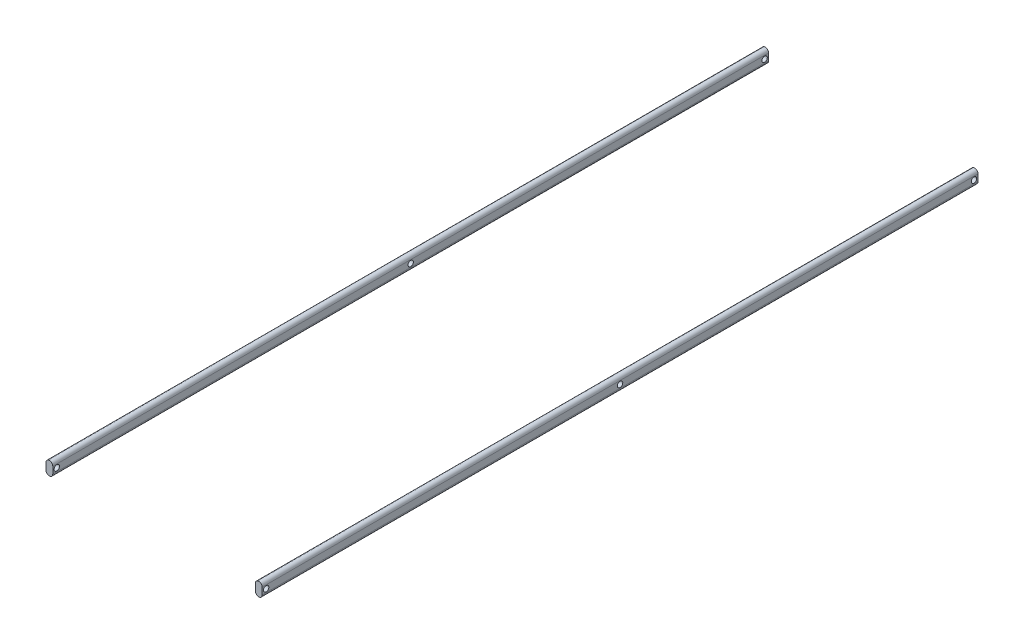
ISO-10303-21;
HEADER;
FILE_DESCRIPTION(('STEP AP214'),'2;1');
FILE_NAME('part.step','',(''),(''),'','','');
FILE_SCHEMA(('AUTOMOTIVE_DESIGN { 1 0 10303 214 1 1 1 1 }'));
ENDSEC;
DATA;
#1=APPLICATION_CONTEXT('core data for automotive mechanical design processes');
#2=APPLICATION_PROTOCOL_DEFINITION('international standard','automotive_design',2000,#1);
#3=PRODUCT_CONTEXT('',#1,'mechanical');
#4=PRODUCT('Part','Part','',(#3));
#5=PRODUCT_RELATED_PRODUCT_CATEGORY('part','',(#4));
#6=PRODUCT_DEFINITION_FORMATION('','',#4);
#7=PRODUCT_DEFINITION_CONTEXT('part definition',#1,'design');
#8=PRODUCT_DEFINITION('design','',#6,#7);
#9=PRODUCT_DEFINITION_SHAPE('','',#8);
#10=(LENGTH_UNIT() NAMED_UNIT(*) SI_UNIT(.MILLI.,.METRE.));
#11=(NAMED_UNIT(*) PLANE_ANGLE_UNIT() SI_UNIT($,.RADIAN.));
#12=(NAMED_UNIT(*) SI_UNIT($,.STERADIAN.) SOLID_ANGLE_UNIT());
#13=UNCERTAINTY_MEASURE_WITH_UNIT(LENGTH_MEASURE(1.E-05),#10,'distance_accuracy_value','');
#14=(GEOMETRIC_REPRESENTATION_CONTEXT(3) GLOBAL_UNCERTAINTY_ASSIGNED_CONTEXT((#13)) GLOBAL_UNIT_ASSIGNED_CONTEXT((#10,
#11,#12)) REPRESENTATION_CONTEXT('',''));
#15=CARTESIAN_POINT('',(0.,0.,0.));
#16=DIRECTION('',(0.,0.,1.));
#17=DIRECTION('',(1.,0.,0.));
#18=AXIS2_PLACEMENT_3D('',#15,#16,#17);
#19=CARTESIAN_POINT('',(26.8333333333334,0.250000000000037,0.));
#20=DIRECTION('',(0.,0.,-1.));
#21=DIRECTION('',(-1.,0.,0.));
#22=AXIS2_PLACEMENT_3D('',#19,#20,#21);
#23=CYLINDRICAL_SURFACE('',#22,2.5);
#24=DIRECTION('',(0.,0.,-1.));
#25=VECTOR('',#24,1.);
#26=CARTESIAN_POINT('',(29.3333333333334,0.250000000000035,530.));
#27=LINE('',#26,#25);
#28=CARTESIAN_POINT('',(29.3333333333334,0.250000000000035,0.));
#29=VERTEX_POINT('',#28);
#30=CARTESIAN_POINT('',(29.3333333333334,0.250000000000035,530.));
#31=VERTEX_POINT('',#30);
#32=EDGE_CURVE('E110',#29,#31,#27,.F.);
#33=ORIENTED_EDGE('',*,*,#32,.F.);
#34=CARTESIAN_POINT('',(26.8333333333334,0.250000000000037,0.));
#35=DIRECTION('',(0.,0.,1.));
#36=DIRECTION('',(1.,0.,0.));
#37=AXIS2_PLACEMENT_3D('',#34,#35,#36);
#38=CIRCLE('',#37,2.5);
#39=CARTESIAN_POINT('',(24.3333333333334,0.250000000000041,0.));
#40=VERTEX_POINT('',#39);
#41=EDGE_CURVE('E68',#40,#29,#38,.F.);
#42=ORIENTED_EDGE('',*,*,#41,.F.);
#43=DIRECTION('',(0.,0.,-1.));
#44=VECTOR('',#43,1.);
#45=CARTESIAN_POINT('',(24.3333333333334,0.250000000000038,530.));
#46=LINE('',#45,#44);
#47=CARTESIAN_POINT('',(24.3333333333334,0.250000000000041,530.));
#48=VERTEX_POINT('',#47);
#49=EDGE_CURVE('E150',#48,#40,#46,.T.);
#50=ORIENTED_EDGE('',*,*,#49,.F.);
#51=CARTESIAN_POINT('',(26.8333333333334,0.250000000000037,530.));
#52=DIRECTION('',(0.,0.,1.));
#53=DIRECTION('',(1.,0.,0.));
#54=AXIS2_PLACEMENT_3D('',#51,#52,#53);
#55=CIRCLE('',#54,2.5);
#56=EDGE_CURVE('E15',#31,#48,#55,.T.);
#57=ORIENTED_EDGE('',*,*,#56,.F.);
#58=EDGE_LOOP('',(#33,#42,#50,#57));
#59=FACE_BOUND('',#58,.T.);
#60=ADVANCED_FACE('F60',(#59),#23,.T.);
#61=CARTESIAN_POINT('',(26.8333333333334,-4.74999999999996,530.));
#62=DIRECTION('',(0.,0.,-1.));
#63=DIRECTION('',(-1.,0.,0.));
#64=AXIS2_PLACEMENT_3D('',#61,#62,#63);
#65=CYLINDRICAL_SURFACE('',#64,2.5);
#66=DIRECTION('',(0.,0.,-1.));
#67=VECTOR('',#66,1.);
#68=CARTESIAN_POINT('',(29.3333333333334,-4.74999999999996,530.));
#69=LINE('',#68,#67);
#70=CARTESIAN_POINT('',(29.3333333333334,-4.74999999999996,530.));
#71=VERTEX_POINT('',#70);
#72=CARTESIAN_POINT('',(29.3333333333334,-4.74999999999996,0.));
#73=VERTEX_POINT('',#72);
#74=EDGE_CURVE('E103',#71,#73,#69,.T.);
#75=ORIENTED_EDGE('',*,*,#74,.F.);
#76=CARTESIAN_POINT('',(26.8333333333334,-4.74999999999996,530.));
#77=DIRECTION('',(0.,0.,1.));
#78=DIRECTION('',(1.,0.,0.));
#79=AXIS2_PLACEMENT_3D('',#76,#77,#78);
#80=CIRCLE('',#79,2.5);
#81=CARTESIAN_POINT('',(24.3333333333334,-4.74999999999996,530.));
#82=VERTEX_POINT('',#81);
#83=EDGE_CURVE('E111',#82,#71,#80,.T.);
#84=ORIENTED_EDGE('',*,*,#83,.F.);
#85=DIRECTION('',(0.,0.,-1.));
#86=VECTOR('',#85,1.);
#87=CARTESIAN_POINT('',(24.3333333333334,-4.74999999999996,530.));
#88=LINE('',#87,#86);
#89=CARTESIAN_POINT('',(24.3333333333334,-4.74999999999996,0.));
#90=VERTEX_POINT('',#89);
#91=EDGE_CURVE('E106',#90,#82,#88,.F.);
#92=ORIENTED_EDGE('',*,*,#91,.F.);
#93=CARTESIAN_POINT('',(26.8333333333334,-4.74999999999996,0.));
#94=DIRECTION('',(0.,0.,1.));
#95=DIRECTION('',(1.,0.,0.));
#96=AXIS2_PLACEMENT_3D('',#93,#94,#95);
#97=CIRCLE('',#96,2.5);
#98=EDGE_CURVE('E99',#73,#90,#97,.F.);
#99=ORIENTED_EDGE('',*,*,#98,.F.);
#100=EDGE_LOOP('',(#75,#84,#92,#99));
#101=FACE_BOUND('',#100,.T.);
#102=ADVANCED_FACE('F101',(#101),#65,.T.);
#103=CARTESIAN_POINT('',(24.3333333333334,2.75000000000004,530.));
#104=DIRECTION('',(1.,0.,0.));
#105=DIRECTION('',(0.,1.,0.));
#106=AXIS2_PLACEMENT_3D('',#103,#104,#105);
#107=PLANE('',#106);
#108=CARTESIAN_POINT('',(24.3333333333334,-2.24999999999996,265.));
#109=DIRECTION('',(1.,0.,0.));
#110=DIRECTION('',(0.,1.,0.));
#111=AXIS2_PLACEMENT_3D('',#108,#109,#110);
#112=CIRCLE('',#111,1.99999999999997);
#113=CARTESIAN_POINT('',(24.3333333333334,-0.249999999999992,265.));
#114=VERTEX_POINT('',#113);
#115=EDGE_CURVE('E140',#114,#114,#112,.T.);
#116=ORIENTED_EDGE('',*,*,#115,.T.);
#117=EDGE_LOOP('',(#116));
#118=FACE_BOUND('',#117,.T.);
#119=CARTESIAN_POINT('',(24.3333333333334,-2.24999999999996,527.));
#120=DIRECTION('',(1.,0.,0.));
#121=DIRECTION('',(0.,1.,0.));
#122=AXIS2_PLACEMENT_3D('',#119,#120,#121);
#123=CIRCLE('',#122,1.99999999999997);
#124=CARTESIAN_POINT('',(24.3333333333334,-0.249999999999992,527.));
#125=VERTEX_POINT('',#124);
#126=EDGE_CURVE('E135',#125,#125,#123,.T.);
#127=ORIENTED_EDGE('',*,*,#126,.T.);
#128=EDGE_LOOP('',(#127));
#129=FACE_BOUND('',#128,.T.);
#130=DIRECTION('',(0.,-1.,0.));
#131=VECTOR('',#130,1.);
#132=CARTESIAN_POINT('',(24.3333333333334,2.75000000000004,530.));
#133=LINE('',#132,#131);
#134=EDGE_CURVE('E132',#48,#82,#133,.T.);
#135=ORIENTED_EDGE('',*,*,#134,.F.);
#136=ORIENTED_EDGE('',*,*,#49,.T.);
#137=DIRECTION('',(0.,-1.,0.));
#138=VECTOR('',#137,1.);
#139=CARTESIAN_POINT('',(24.3333333333334,2.75000000000004,0.));
#140=LINE('',#139,#138);
#141=EDGE_CURVE('E123',#40,#90,#140,.T.);
#142=ORIENTED_EDGE('',*,*,#141,.T.);
#143=ORIENTED_EDGE('',*,*,#91,.T.);
#144=EDGE_LOOP('',(#135,#136,#142,#143));
#145=FACE_BOUND('',#144,.T.);
#146=CARTESIAN_POINT('',(24.3333333333334,-2.24999999999996,3.));
#147=DIRECTION('',(1.,0.,0.));
#148=DIRECTION('',(0.,1.,0.));
#149=AXIS2_PLACEMENT_3D('',#146,#147,#148);
#150=CIRCLE('',#149,1.99999999999997);
#151=CARTESIAN_POINT('',(24.3333333333334,-0.249999999999992,3.));
#152=VERTEX_POINT('',#151);
#153=EDGE_CURVE('E126',#152,#152,#150,.T.);
#154=ORIENTED_EDGE('',*,*,#153,.T.);
#155=EDGE_LOOP('',(#154));
#156=FACE_BOUND('',#155,.T.);
#157=ADVANCED_FACE('F153',(#118,#129,#145,#156),#107,.F.);
#158=CARTESIAN_POINT('',(0.,0.,530.));
#159=DIRECTION('',(0.,0.,1.));
#160=DIRECTION('',(1.,0.,0.));
#161=AXIS2_PLACEMENT_3D('',#158,#159,#160);
#162=PLANE('',#161);
#163=DIRECTION('',(0.,1.,0.));
#164=VECTOR('',#163,1.);
#165=CARTESIAN_POINT('',(29.3333333333334,-7.24999999999996,530.));
#166=LINE('',#165,#164);
#167=EDGE_CURVE('E119',#71,#31,#166,.T.);
#168=ORIENTED_EDGE('',*,*,#167,.T.);
#169=ORIENTED_EDGE('',*,*,#56,.T.);
#170=ORIENTED_EDGE('',*,*,#134,.T.);
#171=ORIENTED_EDGE('',*,*,#83,.T.);
#172=EDGE_LOOP('',(#168,#169,#170,#171));
#173=FACE_BOUND('',#172,.T.);
#174=ADVANCED_FACE('F155',(#173),#162,.T.);
#175=CARTESIAN_POINT('',(29.3333333333334,-2.24999999999996,265.));
#176=DIRECTION('',(1.,0.,0.));
#177=DIRECTION('',(0.,0.,-1.));
#178=AXIS2_PLACEMENT_3D('',#175,#176,#177);
#179=CYLINDRICAL_SURFACE('',#178,1.99999999999997);
#180=CARTESIAN_POINT('',(29.3333333333334,-2.24999999999996,265.));
#181=DIRECTION('',(1.,0.,0.));
#182=DIRECTION('',(0.,0.,-1.));
#183=AXIS2_PLACEMENT_3D('',#180,#181,#182);
#184=CIRCLE('',#183,1.99999999999998);
#185=CARTESIAN_POINT('',(29.3333333333334,-2.24999999999996,263.));
#186=VERTEX_POINT('',#185);
#187=EDGE_CURVE('E129',#186,#186,#184,.T.);
#188=ORIENTED_EDGE('',*,*,#187,.T.);
#189=EDGE_LOOP('',(#188));
#190=FACE_BOUND('',#189,.T.);
#191=ORIENTED_EDGE('',*,*,#115,.F.);
#192=EDGE_LOOP('',(#191));
#193=FACE_BOUND('',#192,.T.);
#194=ADVANCED_FACE('F157',(#190,#193),#179,.F.);
#195=CARTESIAN_POINT('',(29.3333333333334,-2.24999999999996,527.));
#196=DIRECTION('',(1.,0.,0.));
#197=DIRECTION('',(0.,0.,-1.));
#198=AXIS2_PLACEMENT_3D('',#195,#196,#197);
#199=CYLINDRICAL_SURFACE('',#198,1.99999999999997);
#200=CARTESIAN_POINT('',(29.3333333333334,-2.24999999999996,527.));
#201=DIRECTION('',(1.,0.,0.));
#202=DIRECTION('',(0.,0.,-1.));
#203=AXIS2_PLACEMENT_3D('',#200,#201,#202);
#204=CIRCLE('',#203,1.99999999999998);
#205=CARTESIAN_POINT('',(29.3333333333334,-2.24999999999996,525.));
#206=VERTEX_POINT('',#205);
#207=EDGE_CURVE('E124',#206,#206,#204,.T.);
#208=ORIENTED_EDGE('',*,*,#207,.T.);
#209=EDGE_LOOP('',(#208));
#210=FACE_BOUND('',#209,.T.);
#211=ORIENTED_EDGE('',*,*,#126,.F.);
#212=EDGE_LOOP('',(#211));
#213=FACE_BOUND('',#212,.T.);
#214=ADVANCED_FACE('F163',(#210,#213),#199,.F.);
#215=CARTESIAN_POINT('',(29.3333333333334,-7.24999999999996,530.));
#216=DIRECTION('',(-1.,0.,0.));
#217=DIRECTION('',(0.,-1.,0.));
#218=AXIS2_PLACEMENT_3D('',#215,#216,#217);
#219=PLANE('',#218);
#220=ORIENTED_EDGE('',*,*,#187,.F.);
#221=EDGE_LOOP('',(#220));
#222=FACE_BOUND('',#221,.T.);
#223=CARTESIAN_POINT('',(29.3333333333334,-2.24999999999996,3.));
#224=DIRECTION('',(1.,0.,0.));
#225=DIRECTION('',(0.,0.,-1.));
#226=AXIS2_PLACEMENT_3D('',#223,#224,#225);
#227=CIRCLE('',#226,1.99999999999998);
#228=CARTESIAN_POINT('',(29.3333333333334,-2.24999999999996,1.00000000000002));
#229=VERTEX_POINT('',#228);
#230=EDGE_CURVE('E120',#229,#229,#227,.T.);
#231=ORIENTED_EDGE('',*,*,#230,.F.);
#232=EDGE_LOOP('',(#231));
#233=FACE_BOUND('',#232,.T.);
#234=DIRECTION('',(0.,1.,0.));
#235=VECTOR('',#234,1.);
#236=CARTESIAN_POINT('',(29.3333333333334,-7.24999999999996,0.));
#237=LINE('',#236,#235);
#238=EDGE_CURVE('E118',#73,#29,#237,.T.);
#239=ORIENTED_EDGE('',*,*,#238,.T.);
#240=ORIENTED_EDGE('',*,*,#32,.T.);
#241=ORIENTED_EDGE('',*,*,#167,.F.);
#242=ORIENTED_EDGE('',*,*,#74,.T.);
#243=EDGE_LOOP('',(#239,#240,#241,#242));
#244=FACE_BOUND('',#243,.T.);
#245=ORIENTED_EDGE('',*,*,#207,.F.);
#246=EDGE_LOOP('',(#245));
#247=FACE_BOUND('',#246,.T.);
#248=ADVANCED_FACE('F115',(#222,#233,#244,#247),#219,.F.);
#249=CARTESIAN_POINT('',(0.,0.,0.));
#250=DIRECTION('',(0.,0.,1.));
#251=DIRECTION('',(1.,0.,0.));
#252=AXIS2_PLACEMENT_3D('',#249,#250,#251);
#253=PLANE('',#252);
#254=ORIENTED_EDGE('',*,*,#141,.F.);
#255=ORIENTED_EDGE('',*,*,#41,.T.);
#256=ORIENTED_EDGE('',*,*,#238,.F.);
#257=ORIENTED_EDGE('',*,*,#98,.T.);
#258=EDGE_LOOP('',(#254,#255,#256,#257));
#259=FACE_BOUND('',#258,.T.);
#260=ADVANCED_FACE('F122',(#259),#253,.F.);
#261=CARTESIAN_POINT('',(29.3333333333334,-2.24999999999996,3.));
#262=DIRECTION('',(1.,0.,0.));
#263=DIRECTION('',(0.,0.,-1.));
#264=AXIS2_PLACEMENT_3D('',#261,#262,#263);
#265=CYLINDRICAL_SURFACE('',#264,1.99999999999997);
#266=ORIENTED_EDGE('',*,*,#230,.T.);
#267=EDGE_LOOP('',(#266));
#268=FACE_BOUND('',#267,.T.);
#269=ORIENTED_EDGE('',*,*,#153,.F.);
#270=EDGE_LOOP('',(#269));
#271=FACE_BOUND('',#270,.T.);
#272=ADVANCED_FACE('F213',(#268,#271),#265,.F.);
#273=CLOSED_SHELL('',(#60,#102,#157,#174,#194,#214,#248,#260,#272));
#274=MANIFOLD_SOLID_BREP('B2',#273);
#275=CARTESIAN_POINT('',(-128.166666666667,0.250000000000009,530.));
#276=DIRECTION('',(0.,0.,-1.));
#277=DIRECTION('',(-1.,0.,0.));
#278=AXIS2_PLACEMENT_3D('',#275,#276,#277);
#279=CYLINDRICAL_SURFACE('',#278,2.5);
#280=DIRECTION('',(0.,0.,-1.));
#281=VECTOR('',#280,1.);
#282=CARTESIAN_POINT('',(-130.666666666667,0.250000000000009,530.));
#283=LINE('',#282,#281);
#284=CARTESIAN_POINT('',(-130.666666666667,0.250000000000009,530.));
#285=VERTEX_POINT('',#284);
#286=CARTESIAN_POINT('',(-130.666666666667,0.250000000000009,0.));
#287=VERTEX_POINT('',#286);
#288=EDGE_CURVE('E349',#285,#287,#283,.T.);
#289=ORIENTED_EDGE('',*,*,#288,.F.);
#290=CARTESIAN_POINT('',(-128.166666666667,0.250000000000009,530.));
#291=DIRECTION('',(0.,0.,1.));
#292=DIRECTION('',(1.,0.,0.));
#293=AXIS2_PLACEMENT_3D('',#290,#291,#292);
#294=CIRCLE('',#293,2.5);
#295=CARTESIAN_POINT('',(-125.666666666667,0.25000000000001,530.));
#296=VERTEX_POINT('',#295);
#297=EDGE_CURVE('E281',#296,#285,#294,.T.);
#298=ORIENTED_EDGE('',*,*,#297,.F.);
#299=DIRECTION('',(0.,0.,-1.));
#300=VECTOR('',#299,1.);
#301=CARTESIAN_POINT('',(-125.666666666667,0.250000000000009,530.));
#302=LINE('',#301,#300);
#303=CARTESIAN_POINT('',(-125.666666666667,0.25000000000001,0.));
#304=VERTEX_POINT('',#303);
#305=EDGE_CURVE('E335',#304,#296,#302,.F.);
#306=ORIENTED_EDGE('',*,*,#305,.F.);
#307=CARTESIAN_POINT('',(-128.166666666667,0.250000000000009,0.));
#308=DIRECTION('',(0.,0.,1.));
#309=DIRECTION('',(1.,0.,0.));
#310=AXIS2_PLACEMENT_3D('',#307,#308,#309);
#311=CIRCLE('',#310,2.5);
#312=EDGE_CURVE('E58',#287,#304,#311,.F.);
#313=ORIENTED_EDGE('',*,*,#312,.F.);
#314=EDGE_LOOP('',(#289,#298,#306,#313));
#315=FACE_BOUND('',#314,.T.);
#316=ADVANCED_FACE('F273',(#315),#279,.T.);
#317=CARTESIAN_POINT('',(-128.166666666667,-4.74999999999996,530.));
#318=DIRECTION('',(0.,0.,1.));
#319=DIRECTION('',(1.,0.,0.));
#320=AXIS2_PLACEMENT_3D('',#317,#318,#319);
#321=CYLINDRICAL_SURFACE('',#320,2.5);
#322=DIRECTION('',(0.,0.,1.));
#323=VECTOR('',#322,1.);
#324=CARTESIAN_POINT('',(-125.666666666667,-4.74999999999996,530.));
#325=LINE('',#324,#323);
#326=CARTESIAN_POINT('',(-125.666666666667,-4.74999999999996,530.));
#327=VERTEX_POINT('',#326);
#328=CARTESIAN_POINT('',(-125.666666666667,-4.74999999999996,0.));
#329=VERTEX_POINT('',#328);
#330=EDGE_CURVE('E326',#327,#329,#325,.F.);
#331=ORIENTED_EDGE('',*,*,#330,.F.);
#332=CARTESIAN_POINT('',(-128.166666666667,-4.74999999999996,530.));
#333=DIRECTION('',(0.,0.,1.));
#334=DIRECTION('',(1.,0.,0.));
#335=AXIS2_PLACEMENT_3D('',#332,#333,#334);
#336=CIRCLE('',#335,2.5);
#337=CARTESIAN_POINT('',(-130.666666666667,-4.74999999999996,530.));
#338=VERTEX_POINT('',#337);
#339=EDGE_CURVE('E312',#338,#327,#336,.T.);
#340=ORIENTED_EDGE('',*,*,#339,.F.);
#341=DIRECTION('',(0.,0.,1.));
#342=VECTOR('',#341,1.);
#343=CARTESIAN_POINT('',(-130.666666666667,-4.74999999999996,530.));
#344=LINE('',#343,#342);
#345=CARTESIAN_POINT('',(-130.666666666667,-4.74999999999996,0.));
#346=VERTEX_POINT('',#345);
#347=EDGE_CURVE('E323',#346,#338,#344,.T.);
#348=ORIENTED_EDGE('',*,*,#347,.F.);
#349=CARTESIAN_POINT('',(-128.166666666667,-4.74999999999996,0.));
#350=DIRECTION('',(0.,0.,1.));
#351=DIRECTION('',(1.,0.,0.));
#352=AXIS2_PLACEMENT_3D('',#349,#350,#351);
#353=CIRCLE('',#352,2.5);
#354=EDGE_CURVE('E322',#329,#346,#353,.F.);
#355=ORIENTED_EDGE('',*,*,#354,.F.);
#356=EDGE_LOOP('',(#331,#340,#348,#355));
#357=FACE_BOUND('',#356,.T.);
#358=ADVANCED_FACE('F327',(#357),#321,.T.);
#359=CARTESIAN_POINT('',(-130.666666666667,2.75000000000002,530.));
#360=DIRECTION('',(1.,0.,0.));
#361=DIRECTION('',(0.,0.,-1.));
#362=AXIS2_PLACEMENT_3D('',#359,#360,#361);
#363=PLANE('',#362);
#364=CARTESIAN_POINT('',(-130.666666666667,-2.24999999999996,527.));
#365=DIRECTION('',(1.,0.,0.));
#366=DIRECTION('',(0.,0.,-1.));
#367=AXIS2_PLACEMENT_3D('',#364,#365,#366);
#368=CIRCLE('',#367,1.99999999999996);
#369=CARTESIAN_POINT('',(-130.666666666667,-2.24999999999996,525.));
#370=VERTEX_POINT('',#369);
#371=EDGE_CURVE('E387',#370,#370,#368,.T.);
#372=ORIENTED_EDGE('',*,*,#371,.T.);
#373=EDGE_LOOP('',(#372));
#374=FACE_BOUND('',#373,.T.);
#375=CARTESIAN_POINT('',(-130.666666666667,-2.24999999999996,265.));
#376=DIRECTION('',(1.,0.,0.));
#377=DIRECTION('',(0.,0.,-1.));
#378=AXIS2_PLACEMENT_3D('',#375,#376,#377);
#379=CIRCLE('',#378,1.99999999999996);
#380=CARTESIAN_POINT('',(-130.666666666667,-2.24999999999996,263.));
#381=VERTEX_POINT('',#380);
#382=EDGE_CURVE('E391',#381,#381,#379,.T.);
#383=ORIENTED_EDGE('',*,*,#382,.T.);
#384=EDGE_LOOP('',(#383));
#385=FACE_BOUND('',#384,.T.);
#386=CARTESIAN_POINT('',(-130.666666666667,-2.24999999999996,3.));
#387=DIRECTION('',(1.,0.,0.));
#388=DIRECTION('',(0.,0.,-1.));
#389=AXIS2_PLACEMENT_3D('',#386,#387,#388);
#390=CIRCLE('',#389,1.99999999999996);
#391=CARTESIAN_POINT('',(-130.666666666667,-2.24999999999996,1.00000000000004));
#392=VERTEX_POINT('',#391);
#393=EDGE_CURVE('E394',#392,#392,#390,.T.);
#394=ORIENTED_EDGE('',*,*,#393,.T.);
#395=EDGE_LOOP('',(#394));
#396=FACE_BOUND('',#395,.T.);
#397=DIRECTION('',(0.,-1.,0.));
#398=VECTOR('',#397,1.);
#399=CARTESIAN_POINT('',(-130.666666666667,2.75000000000002,530.));
#400=LINE('',#399,#398);
#401=EDGE_CURVE('E318',#285,#338,#400,.T.);
#402=ORIENTED_EDGE('',*,*,#401,.F.);
#403=ORIENTED_EDGE('',*,*,#288,.T.);
#404=DIRECTION('',(0.,-1.,0.));
#405=VECTOR('',#404,1.);
#406=CARTESIAN_POINT('',(-130.666666666667,2.75000000000002,0.));
#407=LINE('',#406,#405);
#408=EDGE_CURVE('E343',#287,#346,#407,.T.);
#409=ORIENTED_EDGE('',*,*,#408,.T.);
#410=ORIENTED_EDGE('',*,*,#347,.T.);
#411=EDGE_LOOP('',(#402,#403,#409,#410));
#412=FACE_BOUND('',#411,.T.);
#413=ADVANCED_FACE('F353',(#374,#385,#396,#412),#363,.F.);
#414=CARTESIAN_POINT('',(29.3333333333334,-2.24999999999996,3.));
#415=DIRECTION('',(1.,0.,0.));
#416=DIRECTION('',(0.,0.,-1.));
#417=AXIS2_PLACEMENT_3D('',#414,#415,#416);
#418=CYLINDRICAL_SURFACE('',#417,1.99999999999997);
#419=ORIENTED_EDGE('',*,*,#393,.F.);
#420=EDGE_LOOP('',(#419));
#421=FACE_BOUND('',#420,.T.);
#422=CARTESIAN_POINT('',(-125.666666666667,-2.24999999999996,3.));
#423=DIRECTION('',(-1.,0.,0.));
#424=DIRECTION('',(0.,0.,1.));
#425=AXIS2_PLACEMENT_3D('',#422,#423,#424);
#426=CIRCLE('',#425,1.99999999999997);
#427=CARTESIAN_POINT('',(-125.666666666667,-2.24999999999996,4.99999999999997));
#428=VERTEX_POINT('',#427);
#429=EDGE_CURVE('E345',#428,#428,#426,.T.);
#430=ORIENTED_EDGE('',*,*,#429,.F.);
#431=EDGE_LOOP('',(#430));
#432=FACE_BOUND('',#431,.T.);
#433=ADVANCED_FACE('F356',(#421,#432),#418,.F.);
#434=CARTESIAN_POINT('',(0.,0.,0.));
#435=DIRECTION('',(0.,0.,1.));
#436=DIRECTION('',(1.,0.,0.));
#437=AXIS2_PLACEMENT_3D('',#434,#435,#436);
#438=PLANE('',#437);
#439=ORIENTED_EDGE('',*,*,#408,.F.);
#440=ORIENTED_EDGE('',*,*,#312,.T.);
#441=DIRECTION('',(0.,1.,0.));
#442=VECTOR('',#441,1.);
#443=CARTESIAN_POINT('',(-125.666666666667,-2.24999999999997,0.));
#444=LINE('',#443,#442);
#445=EDGE_CURVE('E339',#329,#304,#444,.T.);
#446=ORIENTED_EDGE('',*,*,#445,.F.);
#447=ORIENTED_EDGE('',*,*,#354,.T.);
#448=EDGE_LOOP('',(#439,#440,#446,#447));
#449=FACE_BOUND('',#448,.T.);
#450=ADVANCED_FACE('F354',(#449),#438,.F.);
#451=CARTESIAN_POINT('',(-125.666666666667,-2.24999999999997,530.));
#452=DIRECTION('',(-1.,0.,0.));
#453=DIRECTION('',(0.,0.,1.));
#454=AXIS2_PLACEMENT_3D('',#451,#452,#453);
#455=PLANE('',#454);
#456=CARTESIAN_POINT('',(-125.666666666667,-2.24999999999996,265.));
#457=DIRECTION('',(-1.,0.,0.));
#458=DIRECTION('',(0.,0.,1.));
#459=AXIS2_PLACEMENT_3D('',#456,#457,#458);
#460=CIRCLE('',#459,1.99999999999997);
#461=CARTESIAN_POINT('',(-125.666666666667,-2.24999999999996,267.));
#462=VERTEX_POINT('',#461);
#463=EDGE_CURVE('E331',#462,#462,#460,.T.);
#464=ORIENTED_EDGE('',*,*,#463,.T.);
#465=EDGE_LOOP('',(#464));
#466=FACE_BOUND('',#465,.T.);
#467=CARTESIAN_POINT('',(-125.666666666667,-2.24999999999996,527.));
#468=DIRECTION('',(-1.,0.,0.));
#469=DIRECTION('',(0.,0.,1.));
#470=AXIS2_PLACEMENT_3D('',#467,#468,#469);
#471=CIRCLE('',#470,1.99999999999997);
#472=CARTESIAN_POINT('',(-125.666666666667,-2.24999999999996,529.));
#473=VERTEX_POINT('',#472);
#474=EDGE_CURVE('E397',#473,#473,#471,.T.);
#475=ORIENTED_EDGE('',*,*,#474,.T.);
#476=EDGE_LOOP('',(#475));
#477=FACE_BOUND('',#476,.T.);
#478=ORIENTED_EDGE('',*,*,#445,.T.);
#479=ORIENTED_EDGE('',*,*,#305,.T.);
#480=DIRECTION('',(0.,1.,0.));
#481=VECTOR('',#480,1.);
#482=CARTESIAN_POINT('',(-125.666666666667,-2.24999999999997,530.));
#483=LINE('',#482,#481);
#484=EDGE_CURVE('E316',#327,#296,#483,.T.);
#485=ORIENTED_EDGE('',*,*,#484,.F.);
#486=ORIENTED_EDGE('',*,*,#330,.T.);
#487=EDGE_LOOP('',(#478,#479,#485,#486));
#488=FACE_BOUND('',#487,.T.);
#489=ORIENTED_EDGE('',*,*,#429,.T.);
#490=EDGE_LOOP('',(#489));
#491=FACE_BOUND('',#490,.T.);
#492=ADVANCED_FACE('F333',(#466,#477,#488,#491),#455,.F.);
#493=CARTESIAN_POINT('',(29.3333333333334,-2.24999999999996,527.));
#494=DIRECTION('',(1.,0.,0.));
#495=DIRECTION('',(0.,0.,-1.));
#496=AXIS2_PLACEMENT_3D('',#493,#494,#495);
#497=CYLINDRICAL_SURFACE('',#496,1.99999999999997);
#498=ORIENTED_EDGE('',*,*,#371,.F.);
#499=EDGE_LOOP('',(#498));
#500=FACE_BOUND('',#499,.T.);
#501=ORIENTED_EDGE('',*,*,#474,.F.);
#502=EDGE_LOOP('',(#501));
#503=FACE_BOUND('',#502,.T.);
#504=ADVANCED_FACE('F362',(#500,#503),#497,.F.);
#505=CARTESIAN_POINT('',(29.3333333333334,-2.24999999999996,265.));
#506=DIRECTION('',(1.,0.,0.));
#507=DIRECTION('',(0.,0.,-1.));
#508=AXIS2_PLACEMENT_3D('',#505,#506,#507);
#509=CYLINDRICAL_SURFACE('',#508,1.99999999999997);
#510=ORIENTED_EDGE('',*,*,#382,.F.);
#511=EDGE_LOOP('',(#510));
#512=FACE_BOUND('',#511,.T.);
#513=ORIENTED_EDGE('',*,*,#463,.F.);
#514=EDGE_LOOP('',(#513));
#515=FACE_BOUND('',#514,.T.);
#516=ADVANCED_FACE('F406',(#512,#515),#509,.F.);
#517=CARTESIAN_POINT('',(0.,0.,530.));
#518=DIRECTION('',(0.,0.,1.));
#519=DIRECTION('',(1.,0.,0.));
#520=AXIS2_PLACEMENT_3D('',#517,#518,#519);
#521=PLANE('',#520);
#522=ORIENTED_EDGE('',*,*,#484,.T.);
#523=ORIENTED_EDGE('',*,*,#297,.T.);
#524=ORIENTED_EDGE('',*,*,#401,.T.);
#525=ORIENTED_EDGE('',*,*,#339,.T.);
#526=EDGE_LOOP('',(#522,#523,#524,#525));
#527=FACE_BOUND('',#526,.T.);
#528=ADVANCED_FACE('F314',(#527),#521,.T.);
#529=CLOSED_SHELL('',(#316,#358,#413,#433,#450,#492,#504,#516,#528));
#530=MANIFOLD_SOLID_BREP('B9',#529);
#531=ADVANCED_BREP_SHAPE_REPRESENTATION('',(#18,#274,#530),#14);
#532=SHAPE_DEFINITION_REPRESENTATION(#9,#531);
ENDSEC;
END-ISO-10303-21;
